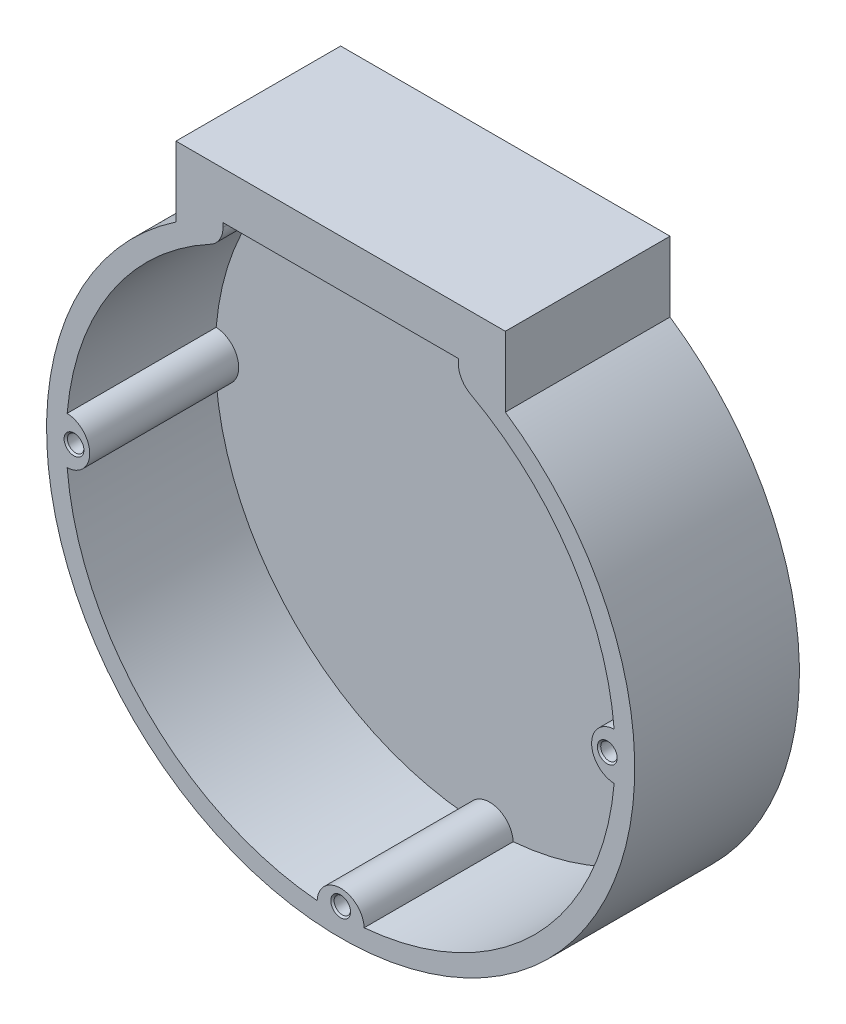
ISO-10303-21;
HEADER;
FILE_DESCRIPTION(('STEP AP214'),'2;1');
FILE_NAME('part.step','',(''),(''),'','','');
FILE_SCHEMA(('AUTOMOTIVE_DESIGN { 1 0 10303 214 1 1 1 1 }'));
ENDSEC;
DATA;
#1=APPLICATION_CONTEXT('core data for automotive mechanical design processes');
#2=APPLICATION_PROTOCOL_DEFINITION('international standard','automotive_design',2000,#1);
#3=PRODUCT_CONTEXT('',#1,'mechanical');
#4=PRODUCT('Part','Part','',(#3));
#5=PRODUCT_RELATED_PRODUCT_CATEGORY('part','',(#4));
#6=PRODUCT_DEFINITION_FORMATION('','',#4);
#7=PRODUCT_DEFINITION_CONTEXT('part definition',#1,'design');
#8=PRODUCT_DEFINITION('design','',#6,#7);
#9=PRODUCT_DEFINITION_SHAPE('','',#8);
#10=(LENGTH_UNIT() NAMED_UNIT(*) SI_UNIT(.MILLI.,.METRE.));
#11=(NAMED_UNIT(*) PLANE_ANGLE_UNIT() SI_UNIT($,.RADIAN.));
#12=(NAMED_UNIT(*) SI_UNIT($,.STERADIAN.) SOLID_ANGLE_UNIT());
#13=UNCERTAINTY_MEASURE_WITH_UNIT(LENGTH_MEASURE(1.E-05),#10,'distance_accuracy_value','');
#14=(GEOMETRIC_REPRESENTATION_CONTEXT(3) GLOBAL_UNCERTAINTY_ASSIGNED_CONTEXT((#13)) GLOBAL_UNIT_ASSIGNED_CONTEXT((#10,
#11,#12)) REPRESENTATION_CONTEXT('',''));
#15=CARTESIAN_POINT('',(0.,0.,0.));
#16=DIRECTION('',(0.,0.,1.));
#17=DIRECTION('',(1.,0.,0.));
#18=AXIS2_PLACEMENT_3D('',#15,#16,#17);
#19=CARTESIAN_POINT('',(0.,0.,42.));
#20=DIRECTION('',(0.,0.,-1.));
#21=DIRECTION('',(-1.,0.,0.));
#22=AXIS2_PLACEMENT_3D('',#19,#20,#21);
#23=CYLINDRICAL_SURFACE('',#22,75.);
#24=CARTESIAN_POINT('',(0.,0.,0.));
#25=DIRECTION('',(0.,0.,1.));
#26=DIRECTION('',(1.,0.,0.));
#27=AXIS2_PLACEMENT_3D('',#24,#25,#26);
#28=CIRCLE('',#27,75.);
#29=CARTESIAN_POINT('',(-42.,62.1369455316239,0.));
#30=VERTEX_POINT('',#29);
#31=CARTESIAN_POINT('',(42.,62.136945531624,0.));
#32=VERTEX_POINT('',#31);
#33=EDGE_CURVE('E248',#30,#32,#28,.T.);
#34=ORIENTED_EDGE('',*,*,#33,.T.);
#35=DIRECTION('',(0.,0.,-1.));
#36=VECTOR('',#35,1.);
#37=CARTESIAN_POINT('',(42.,62.136945531624,42.));
#38=LINE('',#37,#36);
#39=CARTESIAN_POINT('',(42.,62.136945531624,42.));
#40=VERTEX_POINT('',#39);
#41=EDGE_CURVE('E11',#40,#32,#38,.T.);
#42=ORIENTED_EDGE('',*,*,#41,.F.);
#43=CARTESIAN_POINT('',(0.,0.,42.));
#44=DIRECTION('',(0.,0.,1.));
#45=DIRECTION('',(1.,0.,0.));
#46=AXIS2_PLACEMENT_3D('',#43,#44,#45);
#47=CIRCLE('',#46,75.);
#48=CARTESIAN_POINT('',(-42.,62.1369455316239,42.));
#49=VERTEX_POINT('',#48);
#50=EDGE_CURVE('E268',#49,#40,#47,.T.);
#51=ORIENTED_EDGE('',*,*,#50,.F.);
#52=DIRECTION('',(0.,0.,-1.));
#53=VECTOR('',#52,1.);
#54=CARTESIAN_POINT('',(-42.,62.1369455316239,42.));
#55=LINE('',#54,#53);
#56=EDGE_CURVE('E274',#49,#30,#55,.T.);
#57=ORIENTED_EDGE('',*,*,#56,.T.);
#58=EDGE_LOOP('',(#34,#42,#51,#57));
#59=FACE_BOUND('',#58,.T.);
#60=ADVANCED_FACE('F47',(#59),#23,.T.);
#61=CARTESIAN_POINT('',(42.,80.,42.));
#62=DIRECTION('',(-1.,0.,0.));
#63=DIRECTION('',(0.,0.,1.));
#64=AXIS2_PLACEMENT_3D('',#61,#62,#63);
#65=PLANE('',#64);
#66=DIRECTION('',(0.,1.,0.));
#67=VECTOR('',#66,1.);
#68=CARTESIAN_POINT('',(42.,80.,0.));
#69=LINE('',#68,#67);
#70=CARTESIAN_POINT('',(42.,80.,0.));
#71=VERTEX_POINT('',#70);
#72=EDGE_CURVE('E277',#32,#71,#69,.T.);
#73=ORIENTED_EDGE('',*,*,#72,.T.);
#74=DIRECTION('',(0.,0.,-1.));
#75=VECTOR('',#74,1.);
#76=CARTESIAN_POINT('',(42.,80.,42.));
#77=LINE('',#76,#75);
#78=CARTESIAN_POINT('',(42.,80.,42.));
#79=VERTEX_POINT('',#78);
#80=EDGE_CURVE('E54',#79,#71,#77,.T.);
#81=ORIENTED_EDGE('',*,*,#80,.F.);
#82=DIRECTION('',(0.,1.,0.));
#83=VECTOR('',#82,1.);
#84=CARTESIAN_POINT('',(42.,80.,42.));
#85=LINE('',#84,#83);
#86=EDGE_CURVE('E98',#40,#79,#85,.T.);
#87=ORIENTED_EDGE('',*,*,#86,.F.);
#88=ORIENTED_EDGE('',*,*,#41,.T.);
#89=EDGE_LOOP('',(#73,#81,#87,#88));
#90=FACE_BOUND('',#89,.T.);
#91=ADVANCED_FACE('F307',(#90),#65,.F.);
#92=CARTESIAN_POINT('',(-42.,80.,42.));
#93=DIRECTION('',(0.,-1.,0.));
#94=DIRECTION('',(1.,0.,0.));
#95=AXIS2_PLACEMENT_3D('',#92,#93,#94);
#96=PLANE('',#95);
#97=DIRECTION('',(-1.,0.,0.));
#98=VECTOR('',#97,1.);
#99=CARTESIAN_POINT('',(-42.,80.,0.));
#100=LINE('',#99,#98);
#101=CARTESIAN_POINT('',(-42.,80.,0.));
#102=VERTEX_POINT('',#101);
#103=EDGE_CURVE('E279',#71,#102,#100,.T.);
#104=ORIENTED_EDGE('',*,*,#103,.T.);
#105=DIRECTION('',(0.,0.,-1.));
#106=VECTOR('',#105,1.);
#107=CARTESIAN_POINT('',(-42.,80.,42.));
#108=LINE('',#107,#106);
#109=CARTESIAN_POINT('',(-42.,80.,42.));
#110=VERTEX_POINT('',#109);
#111=EDGE_CURVE('E283',#110,#102,#108,.T.);
#112=ORIENTED_EDGE('',*,*,#111,.F.);
#113=DIRECTION('',(-1.,0.,0.));
#114=VECTOR('',#113,1.);
#115=CARTESIAN_POINT('',(-42.,80.,42.));
#116=LINE('',#115,#114);
#117=EDGE_CURVE('E271',#79,#110,#116,.T.);
#118=ORIENTED_EDGE('',*,*,#117,.F.);
#119=ORIENTED_EDGE('',*,*,#80,.T.);
#120=EDGE_LOOP('',(#104,#112,#118,#119));
#121=FACE_BOUND('',#120,.T.);
#122=ADVANCED_FACE('F288',(#121),#96,.F.);
#123=CARTESIAN_POINT('',(-42.,62.1369455316239,42.));
#124=DIRECTION('',(1.,0.,0.));
#125=DIRECTION('',(0.,0.,-1.));
#126=AXIS2_PLACEMENT_3D('',#123,#124,#125);
#127=PLANE('',#126);
#128=DIRECTION('',(0.,-1.,0.));
#129=VECTOR('',#128,1.);
#130=CARTESIAN_POINT('',(-42.,62.1369455316239,0.));
#131=LINE('',#130,#129);
#132=EDGE_CURVE('E91',#102,#30,#131,.T.);
#133=ORIENTED_EDGE('',*,*,#132,.T.);
#134=ORIENTED_EDGE('',*,*,#56,.F.);
#135=DIRECTION('',(0.,-1.,0.));
#136=VECTOR('',#135,1.);
#137=CARTESIAN_POINT('',(-42.,62.1369455316239,42.));
#138=LINE('',#137,#136);
#139=EDGE_CURVE('E70',#110,#49,#138,.T.);
#140=ORIENTED_EDGE('',*,*,#139,.F.);
#141=ORIENTED_EDGE('',*,*,#111,.T.);
#142=EDGE_LOOP('',(#133,#134,#140,#141));
#143=FACE_BOUND('',#142,.T.);
#144=ADVANCED_FACE('F296',(#143),#127,.F.);
#145=CARTESIAN_POINT('',(0.,0.,42.));
#146=DIRECTION('',(0.,0.,1.));
#147=DIRECTION('',(1.,0.,0.));
#148=AXIS2_PLACEMENT_3D('',#145,#146,#147);
#149=PLANE('',#148);
#150=CARTESIAN_POINT('',(68.,-7.03934594889797E-13,42.));
#151=DIRECTION('',(0.,0.,1.));
#152=DIRECTION('',(1.,0.,0.));
#153=AXIS2_PLACEMENT_3D('',#150,#151,#152);
#154=CIRCLE('',#153,2.525);
#155=CARTESIAN_POINT('',(70.525,-7.03934594889797E-13,42.));
#156=VERTEX_POINT('',#155);
#157=EDGE_CURVE('E533',#156,#156,#154,.T.);
#158=ORIENTED_EDGE('',*,*,#157,.F.);
#159=EDGE_LOOP('',(#158));
#160=FACE_BOUND('',#159,.T.);
#161=CARTESIAN_POINT('',(-68.,2.29093132807131E-13,42.));
#162=DIRECTION('',(0.,0.,1.));
#163=DIRECTION('',(1.,0.,0.));
#164=AXIS2_PLACEMENT_3D('',#161,#162,#163);
#165=CIRCLE('',#164,2.525);
#166=CARTESIAN_POINT('',(-65.475,2.29093132807131E-13,42.));
#167=VERTEX_POINT('',#166);
#168=EDGE_CURVE('E540',#167,#167,#165,.T.);
#169=ORIENTED_EDGE('',*,*,#168,.F.);
#170=EDGE_LOOP('',(#169));
#171=FACE_BOUND('',#170,.T.);
#172=CARTESIAN_POINT('',(0.,-68.,42.));
#173=DIRECTION('',(0.,0.,1.));
#174=DIRECTION('',(1.,0.,0.));
#175=AXIS2_PLACEMENT_3D('',#172,#173,#174);
#176=CIRCLE('',#175,2.525);
#177=CARTESIAN_POINT('',(2.52500000000001,-68.,42.));
#178=VERTEX_POINT('',#177);
#179=EDGE_CURVE('E549',#178,#178,#176,.T.);
#180=ORIENTED_EDGE('',*,*,#179,.F.);
#181=EDGE_LOOP('',(#180));
#182=FACE_BOUND('',#181,.T.);
#183=CARTESIAN_POINT('',(0.,0.,42.));
#184=DIRECTION('',(0.,0.,1.));
#185=DIRECTION('',(1.,0.,0.));
#186=AXIS2_PLACEMENT_3D('',#183,#184,#185);
#187=CIRCLE('',#186,70.);
#188=CARTESIAN_POINT('',(5.99448726339629,-69.7428571428571,42.));
#189=VERTEX_POINT('',#188);
#190=CARTESIAN_POINT('',(69.7428571428571,-5.99448726339704,42.));
#191=VERTEX_POINT('',#190);
#192=EDGE_CURVE('E61',#189,#191,#187,.T.);
#193=ORIENTED_EDGE('',*,*,#192,.F.);
#194=CARTESIAN_POINT('',(0.,-70.,42.));
#195=DIRECTION('',(0.,0.,1.));
#196=DIRECTION('',(1.,0.,0.));
#197=AXIS2_PLACEMENT_3D('',#194,#195,#196);
#198=CIRCLE('',#197,6.00000000000001);
#199=CARTESIAN_POINT('',(-5.99448726339631,-69.7428571428571,42.));
#200=VERTEX_POINT('',#199);
#201=EDGE_CURVE('E188',#189,#200,#198,.T.);
#202=ORIENTED_EDGE('',*,*,#201,.T.);
#203=CARTESIAN_POINT('',(0.,0.,42.));
#204=DIRECTION('',(0.,0.,1.));
#205=DIRECTION('',(1.,0.,0.));
#206=AXIS2_PLACEMENT_3D('',#203,#204,#205);
#207=CIRCLE('',#206,70.);
#208=CARTESIAN_POINT('',(-69.7428571428572,-5.99448726339606,42.));
#209=VERTEX_POINT('',#208);
#210=EDGE_CURVE('E191',#209,#200,#207,.T.);
#211=ORIENTED_EDGE('',*,*,#210,.F.);
#212=CARTESIAN_POINT('',(-70.,2.57262485110067E-13,42.));
#213=DIRECTION('',(0.,0.,1.));
#214=DIRECTION('',(1.,0.,0.));
#215=AXIS2_PLACEMENT_3D('',#212,#213,#214);
#216=CIRCLE('',#215,6.00000000000001);
#217=CARTESIAN_POINT('',(-69.7428571428571,5.99448726339656,42.));
#218=VERTEX_POINT('',#217);
#219=EDGE_CURVE('E241',#209,#218,#216,.T.);
#220=ORIENTED_EDGE('',*,*,#219,.T.);
#221=CARTESIAN_POINT('',(0.,0.,42.));
#222=DIRECTION('',(0.,0.,1.));
#223=DIRECTION('',(1.,0.,0.));
#224=AXIS2_PLACEMENT_3D('',#221,#222,#223);
#225=CIRCLE('',#224,70.);
#226=CARTESIAN_POINT('',(-33.1578947368421,61.6486335340898,42.));
#227=VERTEX_POINT('',#226);
#228=EDGE_CURVE('E238',#227,#218,#225,.T.);
#229=ORIENTED_EDGE('',*,*,#228,.F.);
#230=CARTESIAN_POINT('',(-36.,66.932802122726,42.));
#231=DIRECTION('',(0.,0.,1.));
#232=DIRECTION('',(1.,0.,0.));
#233=AXIS2_PLACEMENT_3D('',#230,#231,#232);
#234=CIRCLE('',#233,5.99999999999999);
#235=CARTESIAN_POINT('',(-30.,66.932802122726,42.));
#236=VERTEX_POINT('',#235);
#237=EDGE_CURVE('E235',#227,#236,#234,.T.);
#238=ORIENTED_EDGE('',*,*,#237,.T.);
#239=DIRECTION('',(0.,1.,0.));
#240=VECTOR('',#239,1.);
#241=CARTESIAN_POINT('',(-30.,66.932802122726,42.));
#242=LINE('',#241,#240);
#243=CARTESIAN_POINT('',(-30.,68.,42.));
#244=VERTEX_POINT('',#243);
#245=EDGE_CURVE('E232',#236,#244,#242,.T.);
#246=ORIENTED_EDGE('',*,*,#245,.T.);
#247=DIRECTION('',(1.,0.,0.));
#248=VECTOR('',#247,1.);
#249=CARTESIAN_POINT('',(-30.,68.,42.));
#250=LINE('',#249,#248);
#251=CARTESIAN_POINT('',(30.,68.,42.));
#252=VERTEX_POINT('',#251);
#253=EDGE_CURVE('E229',#244,#252,#250,.T.);
#254=ORIENTED_EDGE('',*,*,#253,.T.);
#255=DIRECTION('',(0.,-1.,0.));
#256=VECTOR('',#255,1.);
#257=CARTESIAN_POINT('',(30.,68.,42.));
#258=LINE('',#257,#256);
#259=CARTESIAN_POINT('',(30.,66.932802122726,42.));
#260=VERTEX_POINT('',#259);
#261=EDGE_CURVE('E226',#252,#260,#258,.T.);
#262=ORIENTED_EDGE('',*,*,#261,.T.);
#263=CARTESIAN_POINT('',(36.,66.9328021227261,42.));
#264=DIRECTION('',(0.,0.,-1.));
#265=DIRECTION('',(-1.,0.,0.));
#266=AXIS2_PLACEMENT_3D('',#263,#264,#265);
#267=CIRCLE('',#266,6.);
#268=CARTESIAN_POINT('',(33.1578947368421,61.6486335340898,42.));
#269=VERTEX_POINT('',#268);
#270=EDGE_CURVE('E223',#269,#260,#267,.T.);
#271=ORIENTED_EDGE('',*,*,#270,.F.);
#272=CARTESIAN_POINT('',(0.,0.,42.));
#273=DIRECTION('',(0.,0.,1.));
#274=DIRECTION('',(1.,0.,0.));
#275=AXIS2_PLACEMENT_3D('',#272,#273,#274);
#276=CIRCLE('',#275,70.);
#277=CARTESIAN_POINT('',(69.7428571428572,5.99448726339559,42.));
#278=VERTEX_POINT('',#277);
#279=EDGE_CURVE('E220',#278,#269,#276,.T.);
#280=ORIENTED_EDGE('',*,*,#279,.F.);
#281=CARTESIAN_POINT('',(70.,-7.46069872548105E-13,42.));
#282=DIRECTION('',(0.,0.,1.));
#283=DIRECTION('',(1.,0.,0.));
#284=AXIS2_PLACEMENT_3D('',#281,#282,#283);
#285=CIRCLE('',#284,6.00000000000001);
#286=EDGE_CURVE('E218',#278,#191,#285,.T.);
#287=ORIENTED_EDGE('',*,*,#286,.T.);
#288=EDGE_LOOP('',(#193,#202,#211,#220,#229,#238,#246,#254,#262,#271,#280,#287));
#289=FACE_BOUND('',#288,.T.);
#290=ORIENTED_EDGE('',*,*,#50,.T.);
#291=ORIENTED_EDGE('',*,*,#86,.T.);
#292=ORIENTED_EDGE('',*,*,#117,.T.);
#293=ORIENTED_EDGE('',*,*,#139,.T.);
#294=EDGE_LOOP('',(#290,#291,#292,#293));
#295=FACE_BOUND('',#294,.T.);
#296=ADVANCED_FACE('F298',(#160,#171,#182,#289,#295),#149,.T.);
#297=CARTESIAN_POINT('',(0.,0.,0.));
#298=DIRECTION('',(0.,0.,1.));
#299=DIRECTION('',(1.,0.,0.));
#300=AXIS2_PLACEMENT_3D('',#297,#298,#299);
#301=PLANE('',#300);
#302=CARTESIAN_POINT('',(68.,-7.03934594889797E-13,0.));
#303=DIRECTION('',(0.,0.,1.));
#304=DIRECTION('',(1.,0.,0.));
#305=AXIS2_PLACEMENT_3D('',#302,#303,#304);
#306=CIRCLE('',#305,2.1);
#307=CARTESIAN_POINT('',(70.1,-7.03934594889797E-13,0.));
#308=VERTEX_POINT('',#307);
#309=EDGE_CURVE('E535',#308,#308,#306,.T.);
#310=ORIENTED_EDGE('',*,*,#309,.T.);
#311=EDGE_LOOP('',(#310));
#312=FACE_BOUND('',#311,.T.);
#313=CARTESIAN_POINT('',(-68.,2.29093132807131E-13,0.));
#314=DIRECTION('',(0.,0.,1.));
#315=DIRECTION('',(1.,0.,0.));
#316=AXIS2_PLACEMENT_3D('',#313,#314,#315);
#317=CIRCLE('',#316,2.1);
#318=CARTESIAN_POINT('',(-65.9,2.29093132807131E-13,0.));
#319=VERTEX_POINT('',#318);
#320=EDGE_CURVE('E546',#319,#319,#317,.T.);
#321=ORIENTED_EDGE('',*,*,#320,.T.);
#322=EDGE_LOOP('',(#321));
#323=FACE_BOUND('',#322,.T.);
#324=CARTESIAN_POINT('',(0.,-68.,0.));
#325=DIRECTION('',(0.,0.,1.));
#326=DIRECTION('',(1.,0.,0.));
#327=AXIS2_PLACEMENT_3D('',#324,#325,#326);
#328=CIRCLE('',#327,2.1);
#329=CARTESIAN_POINT('',(2.1,-68.,0.));
#330=VERTEX_POINT('',#329);
#331=EDGE_CURVE('E194',#330,#330,#328,.T.);
#332=ORIENTED_EDGE('',*,*,#331,.T.);
#333=EDGE_LOOP('',(#332));
#334=FACE_BOUND('',#333,.T.);
#335=ORIENTED_EDGE('',*,*,#33,.F.);
#336=ORIENTED_EDGE('',*,*,#132,.F.);
#337=ORIENTED_EDGE('',*,*,#103,.F.);
#338=ORIENTED_EDGE('',*,*,#72,.F.);
#339=EDGE_LOOP('',(#335,#336,#337,#338));
#340=FACE_BOUND('',#339,.T.);
#341=ADVANCED_FACE('F292',(#312,#323,#334,#340),#301,.F.);
#342=CARTESIAN_POINT('',(0.,0.,4.));
#343=DIRECTION('',(0.,0.,1.));
#344=DIRECTION('',(1.,0.,0.));
#345=AXIS2_PLACEMENT_3D('',#342,#343,#344);
#346=CYLINDRICAL_SURFACE('',#345,70.);
#347=ORIENTED_EDGE('',*,*,#192,.T.);
#348=DIRECTION('',(0.,0.,1.));
#349=VECTOR('',#348,1.);
#350=CARTESIAN_POINT('',(69.7428571428571,-5.99448726339704,4.));
#351=LINE('',#350,#349);
#352=CARTESIAN_POINT('',(69.7428571428571,-5.99448726339704,4.));
#353=VERTEX_POINT('',#352);
#354=EDGE_CURVE('E171',#353,#191,#351,.T.);
#355=ORIENTED_EDGE('',*,*,#354,.F.);
#356=CARTESIAN_POINT('',(0.,0.,4.));
#357=DIRECTION('',(0.,0.,1.));
#358=DIRECTION('',(1.,0.,0.));
#359=AXIS2_PLACEMENT_3D('',#356,#357,#358);
#360=CIRCLE('',#359,70.);
#361=CARTESIAN_POINT('',(5.99448726339629,-69.7428571428571,4.));
#362=VERTEX_POINT('',#361);
#363=EDGE_CURVE('E179',#362,#353,#360,.T.);
#364=ORIENTED_EDGE('',*,*,#363,.F.);
#365=DIRECTION('',(0.,0.,1.));
#366=VECTOR('',#365,1.);
#367=CARTESIAN_POINT('',(5.99448726339629,-69.7428571428571,4.));
#368=LINE('',#367,#366);
#369=EDGE_CURVE('E246',#362,#189,#368,.T.);
#370=ORIENTED_EDGE('',*,*,#369,.T.);
#371=EDGE_LOOP('',(#347,#355,#364,#370));
#372=FACE_BOUND('',#371,.T.);
#373=ADVANCED_FACE('F182',(#372),#346,.F.);
#374=CARTESIAN_POINT('',(0.,-70.,4.));
#375=DIRECTION('',(0.,0.,1.));
#376=DIRECTION('',(1.,0.,0.));
#377=AXIS2_PLACEMENT_3D('',#374,#375,#376);
#378=CYLINDRICAL_SURFACE('',#377,6.00000000000001);
#379=ORIENTED_EDGE('',*,*,#201,.F.);
#380=ORIENTED_EDGE('',*,*,#369,.F.);
#381=CARTESIAN_POINT('',(0.,-70.,4.));
#382=DIRECTION('',(0.,0.,1.));
#383=DIRECTION('',(1.,0.,0.));
#384=AXIS2_PLACEMENT_3D('',#381,#382,#383);
#385=CIRCLE('',#384,6.00000000000001);
#386=CARTESIAN_POINT('',(-5.99448726339631,-69.7428571428571,4.));
#387=VERTEX_POINT('',#386);
#388=EDGE_CURVE('E183',#362,#387,#385,.T.);
#389=ORIENTED_EDGE('',*,*,#388,.T.);
#390=DIRECTION('',(0.,0.,1.));
#391=VECTOR('',#390,1.);
#392=CARTESIAN_POINT('',(-5.99448726339631,-69.7428571428571,4.));
#393=LINE('',#392,#391);
#394=EDGE_CURVE('E249',#387,#200,#393,.T.);
#395=ORIENTED_EDGE('',*,*,#394,.T.);
#396=EDGE_LOOP('',(#379,#380,#389,#395));
#397=FACE_BOUND('',#396,.T.);
#398=ADVANCED_FACE('F334',(#397),#378,.T.);
#399=CARTESIAN_POINT('',(0.,0.,4.));
#400=DIRECTION('',(0.,0.,1.));
#401=DIRECTION('',(1.,0.,0.));
#402=AXIS2_PLACEMENT_3D('',#399,#400,#401);
#403=CYLINDRICAL_SURFACE('',#402,70.);
#404=ORIENTED_EDGE('',*,*,#210,.T.);
#405=ORIENTED_EDGE('',*,*,#394,.F.);
#406=CARTESIAN_POINT('',(0.,0.,4.));
#407=DIRECTION('',(0.,0.,1.));
#408=DIRECTION('',(1.,0.,0.));
#409=AXIS2_PLACEMENT_3D('',#406,#407,#408);
#410=CIRCLE('',#409,70.);
#411=CARTESIAN_POINT('',(-69.7428571428572,-5.99448726339606,4.));
#412=VERTEX_POINT('',#411);
#413=EDGE_CURVE('E214',#412,#387,#410,.T.);
#414=ORIENTED_EDGE('',*,*,#413,.F.);
#415=DIRECTION('',(0.,0.,1.));
#416=VECTOR('',#415,1.);
#417=CARTESIAN_POINT('',(-69.7428571428572,-5.99448726339606,4.));
#418=LINE('',#417,#416);
#419=EDGE_CURVE('E251',#412,#209,#418,.T.);
#420=ORIENTED_EDGE('',*,*,#419,.T.);
#421=EDGE_LOOP('',(#404,#405,#414,#420));
#422=FACE_BOUND('',#421,.T.);
#423=ADVANCED_FACE('F345',(#422),#403,.F.);
#424=CARTESIAN_POINT('',(-70.,2.57262485110067E-13,4.));
#425=DIRECTION('',(0.,0.,1.));
#426=DIRECTION('',(1.,0.,0.));
#427=AXIS2_PLACEMENT_3D('',#424,#425,#426);
#428=CYLINDRICAL_SURFACE('',#427,6.00000000000001);
#429=ORIENTED_EDGE('',*,*,#219,.F.);
#430=ORIENTED_EDGE('',*,*,#419,.F.);
#431=CARTESIAN_POINT('',(-70.,2.57262485110067E-13,4.));
#432=DIRECTION('',(0.,0.,1.));
#433=DIRECTION('',(1.,0.,0.));
#434=AXIS2_PLACEMENT_3D('',#431,#432,#433);
#435=CIRCLE('',#434,6.00000000000001);
#436=CARTESIAN_POINT('',(-69.7428571428571,5.99448726339656,4.));
#437=VERTEX_POINT('',#436);
#438=EDGE_CURVE('E212',#412,#437,#435,.T.);
#439=ORIENTED_EDGE('',*,*,#438,.T.);
#440=DIRECTION('',(0.,0.,1.));
#441=VECTOR('',#440,1.);
#442=CARTESIAN_POINT('',(-69.7428571428571,5.99448726339656,4.));
#443=LINE('',#442,#441);
#444=EDGE_CURVE('E253',#437,#218,#443,.T.);
#445=ORIENTED_EDGE('',*,*,#444,.T.);
#446=EDGE_LOOP('',(#429,#430,#439,#445));
#447=FACE_BOUND('',#446,.T.);
#448=ADVANCED_FACE('F355',(#447),#428,.T.);
#449=CARTESIAN_POINT('',(0.,0.,4.));
#450=DIRECTION('',(0.,0.,1.));
#451=DIRECTION('',(1.,0.,0.));
#452=AXIS2_PLACEMENT_3D('',#449,#450,#451);
#453=CYLINDRICAL_SURFACE('',#452,70.);
#454=ORIENTED_EDGE('',*,*,#228,.T.);
#455=ORIENTED_EDGE('',*,*,#444,.F.);
#456=CARTESIAN_POINT('',(0.,0.,4.));
#457=DIRECTION('',(0.,0.,1.));
#458=DIRECTION('',(1.,0.,0.));
#459=AXIS2_PLACEMENT_3D('',#456,#457,#458);
#460=CIRCLE('',#459,70.);
#461=CARTESIAN_POINT('',(-33.1578947368421,61.6486335340898,4.));
#462=VERTEX_POINT('',#461);
#463=EDGE_CURVE('E209',#462,#437,#460,.T.);
#464=ORIENTED_EDGE('',*,*,#463,.F.);
#465=DIRECTION('',(0.,0.,1.));
#466=VECTOR('',#465,1.);
#467=CARTESIAN_POINT('',(-33.1578947368421,61.6486335340898,4.));
#468=LINE('',#467,#466);
#469=EDGE_CURVE('E255',#462,#227,#468,.T.);
#470=ORIENTED_EDGE('',*,*,#469,.T.);
#471=EDGE_LOOP('',(#454,#455,#464,#470));
#472=FACE_BOUND('',#471,.T.);
#473=ADVANCED_FACE('F365',(#472),#453,.F.);
#474=CARTESIAN_POINT('',(-36.,66.932802122726,4.));
#475=DIRECTION('',(0.,0.,1.));
#476=DIRECTION('',(1.,0.,0.));
#477=AXIS2_PLACEMENT_3D('',#474,#475,#476);
#478=CYLINDRICAL_SURFACE('',#477,5.99999999999999);
#479=ORIENTED_EDGE('',*,*,#237,.F.);
#480=ORIENTED_EDGE('',*,*,#469,.F.);
#481=CARTESIAN_POINT('',(-36.,66.932802122726,4.));
#482=DIRECTION('',(0.,0.,1.));
#483=DIRECTION('',(1.,0.,0.));
#484=AXIS2_PLACEMENT_3D('',#481,#482,#483);
#485=CIRCLE('',#484,5.99999999999999);
#486=CARTESIAN_POINT('',(-30.,66.932802122726,4.));
#487=VERTEX_POINT('',#486);
#488=EDGE_CURVE('E207',#462,#487,#485,.T.);
#489=ORIENTED_EDGE('',*,*,#488,.T.);
#490=DIRECTION('',(0.,0.,1.));
#491=VECTOR('',#490,1.);
#492=CARTESIAN_POINT('',(-30.,66.932802122726,4.));
#493=LINE('',#492,#491);
#494=EDGE_CURVE('E257',#487,#236,#493,.T.);
#495=ORIENTED_EDGE('',*,*,#494,.T.);
#496=EDGE_LOOP('',(#479,#480,#489,#495));
#497=FACE_BOUND('',#496,.T.);
#498=ADVANCED_FACE('F375',(#497),#478,.T.);
#499=CARTESIAN_POINT('',(-30.,66.932802122726,4.));
#500=DIRECTION('',(1.,0.,0.));
#501=DIRECTION('',(0.,0.,-1.));
#502=AXIS2_PLACEMENT_3D('',#499,#500,#501);
#503=PLANE('',#502);
#504=ORIENTED_EDGE('',*,*,#245,.F.);
#505=ORIENTED_EDGE('',*,*,#494,.F.);
#506=DIRECTION('',(0.,1.,0.));
#507=VECTOR('',#506,1.);
#508=CARTESIAN_POINT('',(-30.,66.932802122726,4.));
#509=LINE('',#508,#507);
#510=CARTESIAN_POINT('',(-30.,68.,4.));
#511=VERTEX_POINT('',#510);
#512=EDGE_CURVE('E205',#487,#511,#509,.T.);
#513=ORIENTED_EDGE('',*,*,#512,.T.);
#514=DIRECTION('',(0.,0.,1.));
#515=VECTOR('',#514,1.);
#516=CARTESIAN_POINT('',(-30.,68.,4.));
#517=LINE('',#516,#515);
#518=EDGE_CURVE('E259',#511,#244,#517,.T.);
#519=ORIENTED_EDGE('',*,*,#518,.T.);
#520=EDGE_LOOP('',(#504,#505,#513,#519));
#521=FACE_BOUND('',#520,.T.);
#522=ADVANCED_FACE('F385',(#521),#503,.T.);
#523=CARTESIAN_POINT('',(-30.,68.,4.));
#524=DIRECTION('',(0.,-1.,0.));
#525=DIRECTION('',(1.,0.,0.));
#526=AXIS2_PLACEMENT_3D('',#523,#524,#525);
#527=PLANE('',#526);
#528=ORIENTED_EDGE('',*,*,#253,.F.);
#529=ORIENTED_EDGE('',*,*,#518,.F.);
#530=DIRECTION('',(1.,0.,0.));
#531=VECTOR('',#530,1.);
#532=CARTESIAN_POINT('',(-30.,68.,4.));
#533=LINE('',#532,#531);
#534=CARTESIAN_POINT('',(30.,68.,4.));
#535=VERTEX_POINT('',#534);
#536=EDGE_CURVE('E203',#511,#535,#533,.T.);
#537=ORIENTED_EDGE('',*,*,#536,.T.);
#538=DIRECTION('',(0.,0.,1.));
#539=VECTOR('',#538,1.);
#540=CARTESIAN_POINT('',(30.,68.,4.));
#541=LINE('',#540,#539);
#542=EDGE_CURVE('E261',#535,#252,#541,.T.);
#543=ORIENTED_EDGE('',*,*,#542,.T.);
#544=EDGE_LOOP('',(#528,#529,#537,#543));
#545=FACE_BOUND('',#544,.T.);
#546=ADVANCED_FACE('F395',(#545),#527,.T.);
#547=CARTESIAN_POINT('',(30.,68.,4.));
#548=DIRECTION('',(-1.,0.,0.));
#549=DIRECTION('',(0.,0.,1.));
#550=AXIS2_PLACEMENT_3D('',#547,#548,#549);
#551=PLANE('',#550);
#552=ORIENTED_EDGE('',*,*,#261,.F.);
#553=ORIENTED_EDGE('',*,*,#542,.F.);
#554=DIRECTION('',(0.,-1.,0.));
#555=VECTOR('',#554,1.);
#556=CARTESIAN_POINT('',(30.,68.,4.));
#557=LINE('',#556,#555);
#558=CARTESIAN_POINT('',(30.,66.932802122726,4.));
#559=VERTEX_POINT('',#558);
#560=EDGE_CURVE('E201',#535,#559,#557,.T.);
#561=ORIENTED_EDGE('',*,*,#560,.T.);
#562=DIRECTION('',(0.,0.,1.));
#563=VECTOR('',#562,1.);
#564=CARTESIAN_POINT('',(30.,66.932802122726,4.));
#565=LINE('',#564,#563);
#566=EDGE_CURVE('E263',#559,#260,#565,.T.);
#567=ORIENTED_EDGE('',*,*,#566,.T.);
#568=EDGE_LOOP('',(#552,#553,#561,#567));
#569=FACE_BOUND('',#568,.T.);
#570=ADVANCED_FACE('F405',(#569),#551,.T.);
#571=CARTESIAN_POINT('',(36.,66.9328021227261,4.));
#572=DIRECTION('',(0.,0.,1.));
#573=DIRECTION('',(1.,0.,0.));
#574=AXIS2_PLACEMENT_3D('',#571,#572,#573);
#575=CYLINDRICAL_SURFACE('',#574,6.);
#576=ORIENTED_EDGE('',*,*,#270,.T.);
#577=ORIENTED_EDGE('',*,*,#566,.F.);
#578=CARTESIAN_POINT('',(36.,66.9328021227261,4.));
#579=DIRECTION('',(0.,0.,-1.));
#580=DIRECTION('',(-1.,0.,0.));
#581=AXIS2_PLACEMENT_3D('',#578,#579,#580);
#582=CIRCLE('',#581,6.);
#583=CARTESIAN_POINT('',(33.1578947368421,61.6486335340898,4.));
#584=VERTEX_POINT('',#583);
#585=EDGE_CURVE('E198',#584,#559,#582,.T.);
#586=ORIENTED_EDGE('',*,*,#585,.F.);
#587=DIRECTION('',(0.,0.,1.));
#588=VECTOR('',#587,1.);
#589=CARTESIAN_POINT('',(33.1578947368421,61.6486335340898,4.));
#590=LINE('',#589,#588);
#591=EDGE_CURVE('E265',#584,#269,#590,.T.);
#592=ORIENTED_EDGE('',*,*,#591,.T.);
#593=EDGE_LOOP('',(#576,#577,#586,#592));
#594=FACE_BOUND('',#593,.T.);
#595=ADVANCED_FACE('F415',(#594),#575,.T.);
#596=CARTESIAN_POINT('',(0.,0.,4.));
#597=DIRECTION('',(0.,0.,1.));
#598=DIRECTION('',(1.,0.,0.));
#599=AXIS2_PLACEMENT_3D('',#596,#597,#598);
#600=CYLINDRICAL_SURFACE('',#599,70.);
#601=ORIENTED_EDGE('',*,*,#279,.T.);
#602=ORIENTED_EDGE('',*,*,#591,.F.);
#603=CARTESIAN_POINT('',(0.,0.,4.));
#604=DIRECTION('',(0.,0.,1.));
#605=DIRECTION('',(1.,0.,0.));
#606=AXIS2_PLACEMENT_3D('',#603,#604,#605);
#607=CIRCLE('',#606,70.);
#608=CARTESIAN_POINT('',(69.7428571428572,5.99448726339559,4.));
#609=VERTEX_POINT('',#608);
#610=EDGE_CURVE('E178',#609,#584,#607,.T.);
#611=ORIENTED_EDGE('',*,*,#610,.F.);
#612=DIRECTION('',(0.,0.,1.));
#613=VECTOR('',#612,1.);
#614=CARTESIAN_POINT('',(69.7428571428572,5.99448726339559,4.));
#615=LINE('',#614,#613);
#616=EDGE_CURVE('E173',#609,#278,#615,.T.);
#617=ORIENTED_EDGE('',*,*,#616,.T.);
#618=EDGE_LOOP('',(#601,#602,#611,#617));
#619=FACE_BOUND('',#618,.T.);
#620=ADVANCED_FACE('F425',(#619),#600,.F.);
#621=CARTESIAN_POINT('',(70.,-7.46069872548105E-13,4.));
#622=DIRECTION('',(0.,0.,1.));
#623=DIRECTION('',(1.,0.,0.));
#624=AXIS2_PLACEMENT_3D('',#621,#622,#623);
#625=CYLINDRICAL_SURFACE('',#624,6.00000000000001);
#626=ORIENTED_EDGE('',*,*,#286,.F.);
#627=ORIENTED_EDGE('',*,*,#616,.F.);
#628=CARTESIAN_POINT('',(70.,-7.46069872548105E-13,4.));
#629=DIRECTION('',(0.,0.,1.));
#630=DIRECTION('',(1.,0.,0.));
#631=AXIS2_PLACEMENT_3D('',#628,#629,#630);
#632=CIRCLE('',#631,6.00000000000001);
#633=EDGE_CURVE('E168',#609,#353,#632,.T.);
#634=ORIENTED_EDGE('',*,*,#633,.T.);
#635=ORIENTED_EDGE('',*,*,#354,.T.);
#636=EDGE_LOOP('',(#626,#627,#634,#635));
#637=FACE_BOUND('',#636,.T.);
#638=ADVANCED_FACE('F170',(#637),#625,.T.);
#639=CARTESIAN_POINT('',(0.,0.,4.));
#640=DIRECTION('',(0.,0.,1.));
#641=DIRECTION('',(1.,0.,0.));
#642=AXIS2_PLACEMENT_3D('',#639,#640,#641);
#643=PLANE('',#642);
#644=ORIENTED_EDGE('',*,*,#363,.T.);
#645=ORIENTED_EDGE('',*,*,#633,.F.);
#646=ORIENTED_EDGE('',*,*,#610,.T.);
#647=ORIENTED_EDGE('',*,*,#585,.T.);
#648=ORIENTED_EDGE('',*,*,#560,.F.);
#649=ORIENTED_EDGE('',*,*,#536,.F.);
#650=ORIENTED_EDGE('',*,*,#512,.F.);
#651=ORIENTED_EDGE('',*,*,#488,.F.);
#652=ORIENTED_EDGE('',*,*,#463,.T.);
#653=ORIENTED_EDGE('',*,*,#438,.F.);
#654=ORIENTED_EDGE('',*,*,#413,.T.);
#655=ORIENTED_EDGE('',*,*,#388,.F.);
#656=EDGE_LOOP('',(#644,#645,#646,#647,#648,#649,#650,#651,#652,#653,#654,#655));
#657=FACE_BOUND('',#656,.T.);
#658=ADVANCED_FACE('F186',(#657),#643,.T.);
#659=CARTESIAN_POINT('',(0.,-68.,42.));
#660=DIRECTION('',(0.,0.,1.));
#661=DIRECTION('',(1.,0.,0.));
#662=AXIS2_PLACEMENT_3D('',#659,#660,#661);
#663=CYLINDRICAL_SURFACE('',#662,2.1);
#664=ORIENTED_EDGE('',*,*,#331,.F.);
#665=EDGE_LOOP('',(#664));
#666=FACE_BOUND('',#665,.T.);
#667=CARTESIAN_POINT('',(0.,-68.,41.575));
#668=DIRECTION('',(0.,0.,1.));
#669=DIRECTION('',(1.,0.,0.));
#670=AXIS2_PLACEMENT_3D('',#667,#668,#669);
#671=CIRCLE('',#670,2.1);
#672=CARTESIAN_POINT('',(2.10000000000001,-68.,41.575));
#673=VERTEX_POINT('',#672);
#674=EDGE_CURVE('E551',#673,#673,#671,.T.);
#675=ORIENTED_EDGE('',*,*,#674,.T.);
#676=EDGE_LOOP('',(#675));
#677=FACE_BOUND('',#676,.T.);
#678=ADVANCED_FACE('F452',(#666,#677),#663,.F.);
#679=CARTESIAN_POINT('',(0.,-68.,42.));
#680=DIRECTION('',(0.,0.,1.));
#681=DIRECTION('',(1.,0.,0.));
#682=AXIS2_PLACEMENT_3D('',#679,#680,#681);
#683=CONICAL_SURFACE('',#682,2.525,0.785398163397445);
#684=ORIENTED_EDGE('',*,*,#674,.F.);
#685=EDGE_LOOP('',(#684));
#686=FACE_BOUND('',#685,.T.);
#687=ORIENTED_EDGE('',*,*,#179,.T.);
#688=EDGE_LOOP('',(#687));
#689=FACE_BOUND('',#688,.T.);
#690=ADVANCED_FACE('F461',(#686,#689),#683,.F.);
#691=CARTESIAN_POINT('',(-68.,2.29093132807131E-13,42.));
#692=DIRECTION('',(0.,0.,1.));
#693=DIRECTION('',(1.,0.,0.));
#694=AXIS2_PLACEMENT_3D('',#691,#692,#693);
#695=CYLINDRICAL_SURFACE('',#694,2.1);
#696=ORIENTED_EDGE('',*,*,#320,.F.);
#697=EDGE_LOOP('',(#696));
#698=FACE_BOUND('',#697,.T.);
#699=CARTESIAN_POINT('',(-68.,2.29093132807131E-13,41.575));
#700=DIRECTION('',(0.,0.,1.));
#701=DIRECTION('',(1.,0.,0.));
#702=AXIS2_PLACEMENT_3D('',#699,#700,#701);
#703=CIRCLE('',#702,2.1);
#704=CARTESIAN_POINT('',(-65.9,2.29093132807131E-13,41.575));
#705=VERTEX_POINT('',#704);
#706=EDGE_CURVE('E543',#705,#705,#703,.T.);
#707=ORIENTED_EDGE('',*,*,#706,.T.);
#708=EDGE_LOOP('',(#707));
#709=FACE_BOUND('',#708,.T.);
#710=ADVANCED_FACE('F471',(#698,#709),#695,.F.);
#711=CARTESIAN_POINT('',(-68.,2.29093132807131E-13,42.));
#712=DIRECTION('',(0.,0.,1.));
#713=DIRECTION('',(1.,0.,0.));
#714=AXIS2_PLACEMENT_3D('',#711,#712,#713);
#715=CONICAL_SURFACE('',#714,2.525,0.78539816339744);
#716=ORIENTED_EDGE('',*,*,#706,.F.);
#717=EDGE_LOOP('',(#716));
#718=FACE_BOUND('',#717,.T.);
#719=ORIENTED_EDGE('',*,*,#168,.T.);
#720=EDGE_LOOP('',(#719));
#721=FACE_BOUND('',#720,.T.);
#722=ADVANCED_FACE('F488',(#718,#721),#715,.F.);
#723=CARTESIAN_POINT('',(68.,-7.03934594889797E-13,42.));
#724=DIRECTION('',(0.,0.,1.));
#725=DIRECTION('',(1.,0.,0.));
#726=AXIS2_PLACEMENT_3D('',#723,#724,#725);
#727=CYLINDRICAL_SURFACE('',#726,2.1);
#728=ORIENTED_EDGE('',*,*,#309,.F.);
#729=EDGE_LOOP('',(#728));
#730=FACE_BOUND('',#729,.T.);
#731=CARTESIAN_POINT('',(68.,-7.03934594889797E-13,41.575));
#732=DIRECTION('',(0.,0.,1.));
#733=DIRECTION('',(1.,0.,0.));
#734=AXIS2_PLACEMENT_3D('',#731,#732,#733);
#735=CIRCLE('',#734,2.1);
#736=CARTESIAN_POINT('',(70.1,-7.03934594889797E-13,41.575));
#737=VERTEX_POINT('',#736);
#738=EDGE_CURVE('E530',#737,#737,#735,.T.);
#739=ORIENTED_EDGE('',*,*,#738,.T.);
#740=EDGE_LOOP('',(#739));
#741=FACE_BOUND('',#740,.T.);
#742=ADVANCED_FACE('F498',(#730,#741),#727,.F.);
#743=CARTESIAN_POINT('',(68.,-7.03934594889797E-13,42.));
#744=DIRECTION('',(0.,0.,1.));
#745=DIRECTION('',(1.,0.,0.));
#746=AXIS2_PLACEMENT_3D('',#743,#744,#745);
#747=CONICAL_SURFACE('',#746,2.525,0.78539816339744);
#748=ORIENTED_EDGE('',*,*,#738,.F.);
#749=EDGE_LOOP('',(#748));
#750=FACE_BOUND('',#749,.T.);
#751=ORIENTED_EDGE('',*,*,#157,.T.);
#752=EDGE_LOOP('',(#751));
#753=FACE_BOUND('',#752,.T.);
#754=ADVANCED_FACE('F507',(#750,#753),#747,.F.);
#755=CLOSED_SHELL('',(#60,#91,#122,#144,#296,#341,#373,#398,#423,#448,#473,#498,#522,#546,#570,
#595,#620,#638,#658,#678,#690,#710,#722,#742,#754));
#756=MANIFOLD_SOLID_BREP('B2',#755);
#757=ADVANCED_BREP_SHAPE_REPRESENTATION('',(#18,#756),#14);
#758=SHAPE_DEFINITION_REPRESENTATION(#9,#757);
ENDSEC;
END-ISO-10303-21;
